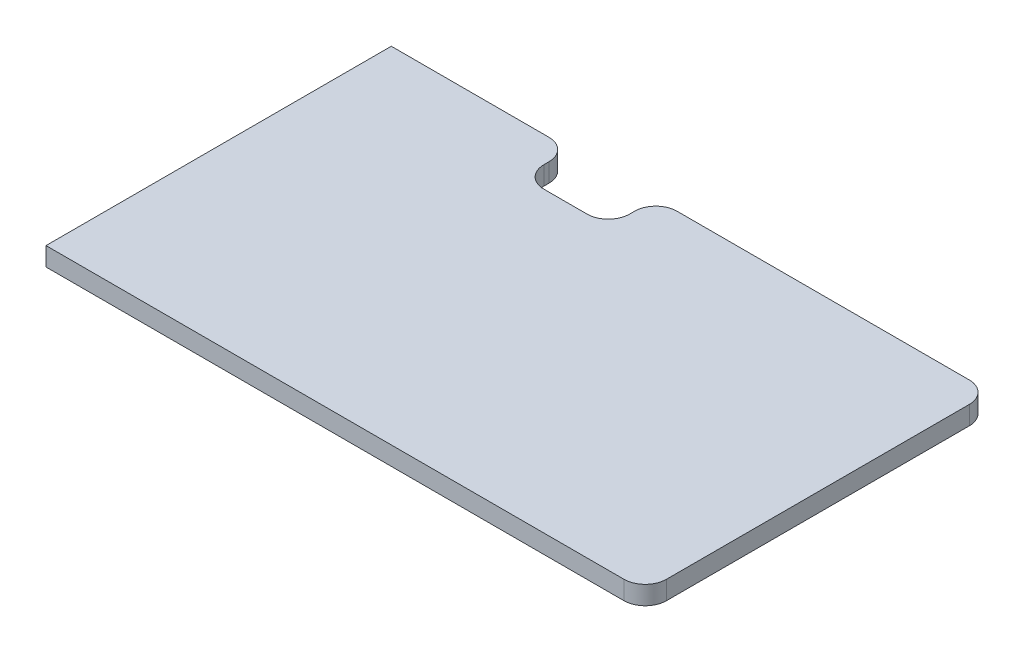
ISO-10303-21;
HEADER;
FILE_DESCRIPTION(('STEP AP214'),'2;1');
FILE_NAME('part.step','',(''),(''),'','','');
FILE_SCHEMA(('AUTOMOTIVE_DESIGN { 1 0 10303 214 1 1 1 1 }'));
ENDSEC;
DATA;
#1=APPLICATION_CONTEXT('core data for automotive mechanical design processes');
#2=APPLICATION_PROTOCOL_DEFINITION('international standard','automotive_design',2000,#1);
#3=PRODUCT_CONTEXT('',#1,'mechanical');
#4=PRODUCT('Part','Part','',(#3));
#5=PRODUCT_RELATED_PRODUCT_CATEGORY('part','',(#4));
#6=PRODUCT_DEFINITION_FORMATION('','',#4);
#7=PRODUCT_DEFINITION_CONTEXT('part definition',#1,'design');
#8=PRODUCT_DEFINITION('design','',#6,#7);
#9=PRODUCT_DEFINITION_SHAPE('','',#8);
#10=(LENGTH_UNIT() NAMED_UNIT(*) SI_UNIT(.MILLI.,.METRE.));
#11=(NAMED_UNIT(*) PLANE_ANGLE_UNIT() SI_UNIT($,.RADIAN.));
#12=(NAMED_UNIT(*) SI_UNIT($,.STERADIAN.) SOLID_ANGLE_UNIT());
#13=UNCERTAINTY_MEASURE_WITH_UNIT(LENGTH_MEASURE(1.E-05),#10,'distance_accuracy_value','');
#14=(GEOMETRIC_REPRESENTATION_CONTEXT(3) GLOBAL_UNCERTAINTY_ASSIGNED_CONTEXT((#13)) GLOBAL_UNIT_ASSIGNED_CONTEXT((#10,
#11,#12)) REPRESENTATION_CONTEXT('',''));
#15=CARTESIAN_POINT('',(0.,0.,0.));
#16=DIRECTION('',(0.,0.,1.));
#17=DIRECTION('',(1.,0.,0.));
#18=AXIS2_PLACEMENT_3D('',#15,#16,#17);
#19=CARTESIAN_POINT('',(-0.333250558352,0.28,0.215));
#20=DIRECTION('',(0.,-1.,0.));
#21=DIRECTION('',(0.,0.,-1.));
#22=AXIS2_PLACEMENT_3D('',#19,#20,#21);
#23=PLANE('',#22);
#24=DIRECTION('',(0.,0.,1.));
#25=VECTOR('',#24,1.);
#26=CARTESIAN_POINT('',(-0.63,0.28,0.825));
#27=LINE('',#26,#25);
#28=CARTESIAN_POINT('',(-0.63,0.28,0.175));
#29=VERTEX_POINT('',#28);
#30=CARTESIAN_POINT('',(-0.63,0.28,0.825));
#31=VERTEX_POINT('',#30);
#32=EDGE_CURVE('E174',#29,#31,#27,.T.);
#33=ORIENTED_EDGE('',*,*,#32,.F.);
#34=DIRECTION('',(-1.,0.,0.));
#35=VECTOR('',#34,1.);
#36=CARTESIAN_POINT('',(-0.63,0.28,0.175));
#37=LINE('',#36,#35);
#38=CARTESIAN_POINT('',(-0.333250558352,0.28,0.175));
#39=VERTEX_POINT('',#38);
#40=EDGE_CURVE('E28',#39,#29,#37,.T.);
#41=ORIENTED_EDGE('',*,*,#40,.F.);
#42=CARTESIAN_POINT('',(-0.333250558352,0.28,0.215));
#43=DIRECTION('',(0.,1.,0.));
#44=DIRECTION('',(0.,0.,-1.));
#45=AXIS2_PLACEMENT_3D('',#42,#43,#44);
#46=CIRCLE('',#45,0.04);
#47=CARTESIAN_POINT('',(-0.293250558352,0.28,0.215));
#48=VERTEX_POINT('',#47);
#49=EDGE_CURVE('E167',#48,#39,#46,.T.);
#50=ORIENTED_EDGE('',*,*,#49,.F.);
#51=DIRECTION('',(0.,0.,-1.));
#52=VECTOR('',#51,1.);
#53=CARTESIAN_POINT('',(-0.293250558352,0.28,0.215));
#54=LINE('',#53,#52);
#55=CARTESIAN_POINT('',(-0.293250558352,0.28,0.224389621479));
#56=VERTEX_POINT('',#55);
#57=EDGE_CURVE('E230',#56,#48,#54,.T.);
#58=ORIENTED_EDGE('',*,*,#57,.F.);
#59=CARTESIAN_POINT('',(-0.253250558352,0.28,0.224389621479));
#60=DIRECTION('',(0.,-1.,0.));
#61=DIRECTION('',(0.,0.,1.));
#62=AXIS2_PLACEMENT_3D('',#59,#60,#61);
#63=CIRCLE('',#62,0.04);
#64=CARTESIAN_POINT('',(-0.253250558352,0.28,0.264389621479));
#65=VERTEX_POINT('',#64);
#66=EDGE_CURVE('E190',#65,#56,#63,.T.);
#67=ORIENTED_EDGE('',*,*,#66,.F.);
#68=DIRECTION('',(-1.,0.,0.));
#69=VECTOR('',#68,1.);
#70=CARTESIAN_POINT('',(-0.253250558352,0.28,0.264389621479));
#71=LINE('',#70,#69);
#72=CARTESIAN_POINT('',(-0.172018831036,0.28,0.264389621479));
#73=VERTEX_POINT('',#72);
#74=EDGE_CURVE('E204',#73,#65,#71,.T.);
#75=ORIENTED_EDGE('',*,*,#74,.F.);
#76=CARTESIAN_POINT('',(-0.172018831036,0.28,0.224389621479));
#77=DIRECTION('',(0.,-1.,0.));
#78=DIRECTION('',(0.,0.,1.));
#79=AXIS2_PLACEMENT_3D('',#76,#77,#78);
#80=CIRCLE('',#79,0.04);
#81=CARTESIAN_POINT('',(-0.132018831036,0.28,0.224389621479));
#82=VERTEX_POINT('',#81);
#83=EDGE_CURVE('E173',#82,#73,#80,.T.);
#84=ORIENTED_EDGE('',*,*,#83,.F.);
#85=DIRECTION('',(0.,0.,1.));
#86=VECTOR('',#85,1.);
#87=CARTESIAN_POINT('',(-0.132018831036,0.28,0.224389621479));
#88=LINE('',#87,#86);
#89=CARTESIAN_POINT('',(-0.132018831036,0.28,0.215));
#90=VERTEX_POINT('',#89);
#91=EDGE_CURVE('E158',#90,#82,#88,.T.);
#92=ORIENTED_EDGE('',*,*,#91,.F.);
#93=CARTESIAN_POINT('',(-0.09201883103617,0.28,0.215));
#94=DIRECTION('',(0.,1.,0.));
#95=DIRECTION('',(0.,0.,-1.));
#96=AXIS2_PLACEMENT_3D('',#93,#94,#95);
#97=CIRCLE('',#96,0.04);
#98=CARTESIAN_POINT('',(-0.09201883103617,0.28,0.175));
#99=VERTEX_POINT('',#98);
#100=EDGE_CURVE('E211',#99,#90,#97,.T.);
#101=ORIENTED_EDGE('',*,*,#100,.F.);
#102=DIRECTION('',(-1.,0.,0.));
#103=VECTOR('',#102,1.);
#104=CARTESIAN_POINT('',(-0.09201883103617,0.28,0.175));
#105=LINE('',#104,#103);
#106=CARTESIAN_POINT('',(0.458042276458,0.28,0.175));
#107=VERTEX_POINT('',#106);
#108=EDGE_CURVE('E106',#107,#99,#105,.T.);
#109=ORIENTED_EDGE('',*,*,#108,.F.);
#110=CARTESIAN_POINT('',(0.458042276458,0.28,0.215));
#111=DIRECTION('',(0.,1.,0.));
#112=DIRECTION('',(0.,0.,-1.));
#113=AXIS2_PLACEMENT_3D('',#110,#111,#112);
#114=CIRCLE('',#113,0.04);
#115=CARTESIAN_POINT('',(0.498042276458,0.28,0.215));
#116=VERTEX_POINT('',#115);
#117=EDGE_CURVE('E137',#116,#107,#114,.T.);
#118=ORIENTED_EDGE('',*,*,#117,.F.);
#119=DIRECTION('',(0.,0.,-1.));
#120=VECTOR('',#119,1.);
#121=CARTESIAN_POINT('',(0.498042276458,0.28,0.215));
#122=LINE('',#121,#120);
#123=CARTESIAN_POINT('',(0.498042276458,0.28,0.785));
#124=VERTEX_POINT('',#123);
#125=EDGE_CURVE('E141',#124,#116,#122,.T.);
#126=ORIENTED_EDGE('',*,*,#125,.F.);
#127=CARTESIAN_POINT('',(0.458042276458,0.28,0.785));
#128=DIRECTION('',(0.,1.,0.));
#129=DIRECTION('',(0.,0.,-1.));
#130=AXIS2_PLACEMENT_3D('',#127,#128,#129);
#131=CIRCLE('',#130,0.04);
#132=CARTESIAN_POINT('',(0.458042276458,0.28,0.825));
#133=VERTEX_POINT('',#132);
#134=EDGE_CURVE('E182',#133,#124,#131,.T.);
#135=ORIENTED_EDGE('',*,*,#134,.F.);
#136=DIRECTION('',(1.,0.,0.));
#137=VECTOR('',#136,1.);
#138=CARTESIAN_POINT('',(0.458042276458,0.28,0.825));
#139=LINE('',#138,#137);
#140=EDGE_CURVE('E236',#31,#133,#139,.T.);
#141=ORIENTED_EDGE('',*,*,#140,.F.);
#142=EDGE_LOOP('',(#33,#41,#50,#58,#67,#75,#84,#92,#101,#109,#118,#126,#135,#141));
#143=FACE_BOUND('',#142,.T.);
#144=ADVANCED_FACE('F17',(#143),#23,.T.);
#145=CARTESIAN_POINT('',(-0.333250558352,0.315,0.215));
#146=DIRECTION('',(0.,-1.,0.));
#147=DIRECTION('',(0.,0.,-1.));
#148=AXIS2_PLACEMENT_3D('',#145,#146,#147);
#149=PLANE('',#148);
#150=DIRECTION('',(0.,0.,1.));
#151=VECTOR('',#150,1.);
#152=CARTESIAN_POINT('',(-0.63,0.315,0.825));
#153=LINE('',#152,#151);
#154=CARTESIAN_POINT('',(-0.63,0.315,0.175));
#155=VERTEX_POINT('',#154);
#156=CARTESIAN_POINT('',(-0.63,0.315,0.825));
#157=VERTEX_POINT('',#156);
#158=EDGE_CURVE('E195',#155,#157,#153,.T.);
#159=ORIENTED_EDGE('',*,*,#158,.T.);
#160=DIRECTION('',(1.,0.,0.));
#161=VECTOR('',#160,1.);
#162=CARTESIAN_POINT('',(0.458042276458,0.315,0.825));
#163=LINE('',#162,#161);
#164=CARTESIAN_POINT('',(0.458042276458,0.315,0.825));
#165=VERTEX_POINT('',#164);
#166=EDGE_CURVE('E179',#157,#165,#163,.T.);
#167=ORIENTED_EDGE('',*,*,#166,.T.);
#168=CARTESIAN_POINT('',(0.458042276458,0.315,0.785));
#169=DIRECTION('',(0.,1.,0.));
#170=DIRECTION('',(0.,0.,-1.));
#171=AXIS2_PLACEMENT_3D('',#168,#169,#170);
#172=CIRCLE('',#171,0.04);
#173=CARTESIAN_POINT('',(0.498042276458,0.315,0.785));
#174=VERTEX_POINT('',#173);
#175=EDGE_CURVE('E132',#165,#174,#172,.T.);
#176=ORIENTED_EDGE('',*,*,#175,.T.);
#177=DIRECTION('',(0.,0.,-1.));
#178=VECTOR('',#177,1.);
#179=CARTESIAN_POINT('',(0.498042276458,0.315,0.215));
#180=LINE('',#179,#178);
#181=CARTESIAN_POINT('',(0.498042276458,0.315,0.215));
#182=VERTEX_POINT('',#181);
#183=EDGE_CURVE('E128',#174,#182,#180,.T.);
#184=ORIENTED_EDGE('',*,*,#183,.T.);
#185=CARTESIAN_POINT('',(0.458042276458,0.315,0.215));
#186=DIRECTION('',(0.,1.,0.));
#187=DIRECTION('',(0.,0.,-1.));
#188=AXIS2_PLACEMENT_3D('',#185,#186,#187);
#189=CIRCLE('',#188,0.04);
#190=CARTESIAN_POINT('',(0.458042276458,0.315,0.175));
#191=VERTEX_POINT('',#190);
#192=EDGE_CURVE('E115',#182,#191,#189,.T.);
#193=ORIENTED_EDGE('',*,*,#192,.T.);
#194=DIRECTION('',(-1.,0.,0.));
#195=VECTOR('',#194,1.);
#196=CARTESIAN_POINT('',(-0.09201883103617,0.315,0.175));
#197=LINE('',#196,#195);
#198=CARTESIAN_POINT('',(-0.09201883103617,0.315,0.175));
#199=VERTEX_POINT('',#198);
#200=EDGE_CURVE('E208',#191,#199,#197,.T.);
#201=ORIENTED_EDGE('',*,*,#200,.T.);
#202=CARTESIAN_POINT('',(-0.09201883103617,0.315,0.215));
#203=DIRECTION('',(0.,1.,0.));
#204=DIRECTION('',(0.,0.,-1.));
#205=AXIS2_PLACEMENT_3D('',#202,#203,#204);
#206=CIRCLE('',#205,0.04);
#207=CARTESIAN_POINT('',(-0.132018831036,0.315,0.215));
#208=VERTEX_POINT('',#207);
#209=EDGE_CURVE('E161',#199,#208,#206,.T.);
#210=ORIENTED_EDGE('',*,*,#209,.T.);
#211=DIRECTION('',(0.,0.,1.));
#212=VECTOR('',#211,1.);
#213=CARTESIAN_POINT('',(-0.132018831036,0.315,0.224389621479));
#214=LINE('',#213,#212);
#215=CARTESIAN_POINT('',(-0.132018831036,0.315,0.224389621479));
#216=VERTEX_POINT('',#215);
#217=EDGE_CURVE('E200',#208,#216,#214,.T.);
#218=ORIENTED_EDGE('',*,*,#217,.T.);
#219=CARTESIAN_POINT('',(-0.172018831036,0.315,0.224389621479));
#220=DIRECTION('',(0.,-1.,0.));
#221=DIRECTION('',(0.,0.,1.));
#222=AXIS2_PLACEMENT_3D('',#219,#220,#221);
#223=CIRCLE('',#222,0.04);
#224=CARTESIAN_POINT('',(-0.172018831036,0.315,0.264389621479));
#225=VERTEX_POINT('',#224);
#226=EDGE_CURVE('E172',#216,#225,#223,.T.);
#227=ORIENTED_EDGE('',*,*,#226,.T.);
#228=DIRECTION('',(-1.,0.,0.));
#229=VECTOR('',#228,1.);
#230=CARTESIAN_POINT('',(-0.253250558352,0.315,0.264389621479));
#231=LINE('',#230,#229);
#232=CARTESIAN_POINT('',(-0.253250558352,0.315,0.264389621479));
#233=VERTEX_POINT('',#232);
#234=EDGE_CURVE('E186',#225,#233,#231,.T.);
#235=ORIENTED_EDGE('',*,*,#234,.T.);
#236=CARTESIAN_POINT('',(-0.253250558352,0.315,0.224389621479));
#237=DIRECTION('',(0.,-1.,0.));
#238=DIRECTION('',(0.,0.,1.));
#239=AXIS2_PLACEMENT_3D('',#236,#237,#238);
#240=CIRCLE('',#239,0.04);
#241=CARTESIAN_POINT('',(-0.293250558352,0.315,0.224389621479));
#242=VERTEX_POINT('',#241);
#243=EDGE_CURVE('E234',#233,#242,#240,.T.);
#244=ORIENTED_EDGE('',*,*,#243,.T.);
#245=DIRECTION('',(0.,0.,-1.));
#246=VECTOR('',#245,1.);
#247=CARTESIAN_POINT('',(-0.293250558352,0.315,0.215));
#248=LINE('',#247,#246);
#249=CARTESIAN_POINT('',(-0.293250558352,0.315,0.215));
#250=VERTEX_POINT('',#249);
#251=EDGE_CURVE('E265',#242,#250,#248,.T.);
#252=ORIENTED_EDGE('',*,*,#251,.T.);
#253=CARTESIAN_POINT('',(-0.333250558352,0.315,0.215));
#254=DIRECTION('',(0.,1.,0.));
#255=DIRECTION('',(0.,0.,-1.));
#256=AXIS2_PLACEMENT_3D('',#253,#254,#255);
#257=CIRCLE('',#256,0.04);
#258=CARTESIAN_POINT('',(-0.333250558352,0.315,0.175));
#259=VERTEX_POINT('',#258);
#260=EDGE_CURVE('E166',#250,#259,#257,.T.);
#261=ORIENTED_EDGE('',*,*,#260,.T.);
#262=DIRECTION('',(-1.,0.,0.));
#263=VECTOR('',#262,1.);
#264=CARTESIAN_POINT('',(-0.63,0.315,0.175));
#265=LINE('',#264,#263);
#266=EDGE_CURVE('E11',#259,#155,#265,.T.);
#267=ORIENTED_EDGE('',*,*,#266,.T.);
#268=EDGE_LOOP('',(#159,#167,#176,#184,#193,#201,#210,#218,#227,#235,#244,#252,#261,#267));
#269=FACE_BOUND('',#268,.T.);
#270=ADVANCED_FACE('F130',(#269),#149,.F.);
#271=CARTESIAN_POINT('',(-0.63,0.315,0.175));
#272=DIRECTION('',(0.,0.,1.));
#273=DIRECTION('',(1.,0.,0.));
#274=AXIS2_PLACEMENT_3D('',#271,#272,#273);
#275=PLANE('',#274);
#276=ORIENTED_EDGE('',*,*,#40,.T.);
#277=DIRECTION('',(0.,-1.,0.));
#278=VECTOR('',#277,1.);
#279=CARTESIAN_POINT('',(-0.63,0.315,0.175));
#280=LINE('',#279,#278);
#281=EDGE_CURVE('E243',#155,#29,#280,.T.);
#282=ORIENTED_EDGE('',*,*,#281,.F.);
#283=ORIENTED_EDGE('',*,*,#266,.F.);
#284=DIRECTION('',(0.,-1.,0.));
#285=VECTOR('',#284,1.);
#286=CARTESIAN_POINT('',(-0.333250558352,0.315,0.175));
#287=LINE('',#286,#285);
#288=EDGE_CURVE('E163',#259,#39,#287,.T.);
#289=ORIENTED_EDGE('',*,*,#288,.T.);
#290=EDGE_LOOP('',(#276,#282,#283,#289));
#291=FACE_BOUND('',#290,.T.);
#292=ADVANCED_FACE('F279',(#291),#275,.F.);
#293=CARTESIAN_POINT('',(-0.333250558352,0.315,0.215));
#294=DIRECTION('',(0.,-1.,0.));
#295=DIRECTION('',(0.,0.,-1.));
#296=AXIS2_PLACEMENT_3D('',#293,#294,#295);
#297=CYLINDRICAL_SURFACE('',#296,0.04);
#298=ORIENTED_EDGE('',*,*,#49,.T.);
#299=ORIENTED_EDGE('',*,*,#288,.F.);
#300=ORIENTED_EDGE('',*,*,#260,.F.);
#301=DIRECTION('',(0.,-1.,0.));
#302=VECTOR('',#301,1.);
#303=CARTESIAN_POINT('',(-0.293250558352,0.315,0.215));
#304=LINE('',#303,#302);
#305=EDGE_CURVE('E233',#250,#48,#304,.T.);
#306=ORIENTED_EDGE('',*,*,#305,.T.);
#307=EDGE_LOOP('',(#298,#299,#300,#306));
#308=FACE_BOUND('',#307,.T.);
#309=ADVANCED_FACE('F347',(#308),#297,.T.);
#310=CARTESIAN_POINT('',(-0.293250558352,0.315,0.215));
#311=DIRECTION('',(-1.,0.,0.));
#312=DIRECTION('',(0.,0.,1.));
#313=AXIS2_PLACEMENT_3D('',#310,#311,#312);
#314=PLANE('',#313);
#315=ORIENTED_EDGE('',*,*,#57,.T.);
#316=ORIENTED_EDGE('',*,*,#305,.F.);
#317=ORIENTED_EDGE('',*,*,#251,.F.);
#318=DIRECTION('',(0.,-1.,0.));
#319=VECTOR('',#318,1.);
#320=CARTESIAN_POINT('',(-0.293250558352,0.315,0.224389621479));
#321=LINE('',#320,#319);
#322=EDGE_CURVE('E156',#242,#56,#321,.T.);
#323=ORIENTED_EDGE('',*,*,#322,.T.);
#324=EDGE_LOOP('',(#315,#316,#317,#323));
#325=FACE_BOUND('',#324,.T.);
#326=ADVANCED_FACE('F350',(#325),#314,.F.);
#327=CARTESIAN_POINT('',(-0.253250558352,0.315,0.224389621479));
#328=DIRECTION('',(0.,-1.,0.));
#329=DIRECTION('',(0.,0.,-1.));
#330=AXIS2_PLACEMENT_3D('',#327,#328,#329);
#331=CYLINDRICAL_SURFACE('',#330,0.04);
#332=ORIENTED_EDGE('',*,*,#66,.T.);
#333=ORIENTED_EDGE('',*,*,#322,.F.);
#334=ORIENTED_EDGE('',*,*,#243,.F.);
#335=DIRECTION('',(0.,-1.,0.));
#336=VECTOR('',#335,1.);
#337=CARTESIAN_POINT('',(-0.253250558352,0.315,0.264389621479));
#338=LINE('',#337,#336);
#339=EDGE_CURVE('E191',#233,#65,#338,.T.);
#340=ORIENTED_EDGE('',*,*,#339,.T.);
#341=EDGE_LOOP('',(#332,#333,#334,#340));
#342=FACE_BOUND('',#341,.T.);
#343=ADVANCED_FACE('F354',(#342),#331,.F.);
#344=CARTESIAN_POINT('',(-0.253250558352,0.315,0.264389621479));
#345=DIRECTION('',(0.,0.,1.));
#346=DIRECTION('',(1.,0.,0.));
#347=AXIS2_PLACEMENT_3D('',#344,#345,#346);
#348=PLANE('',#347);
#349=ORIENTED_EDGE('',*,*,#74,.T.);
#350=ORIENTED_EDGE('',*,*,#339,.F.);
#351=ORIENTED_EDGE('',*,*,#234,.F.);
#352=DIRECTION('',(0.,-1.,0.));
#353=VECTOR('',#352,1.);
#354=CARTESIAN_POINT('',(-0.172018831036,0.315,0.264389621479));
#355=LINE('',#354,#353);
#356=EDGE_CURVE('E168',#225,#73,#355,.T.);
#357=ORIENTED_EDGE('',*,*,#356,.T.);
#358=EDGE_LOOP('',(#349,#350,#351,#357));
#359=FACE_BOUND('',#358,.T.);
#360=ADVANCED_FACE('F356',(#359),#348,.F.);
#361=CARTESIAN_POINT('',(-0.172018831036,0.315,0.224389621479));
#362=DIRECTION('',(0.,-1.,0.));
#363=DIRECTION('',(0.,0.,-1.));
#364=AXIS2_PLACEMENT_3D('',#361,#362,#363);
#365=CYLINDRICAL_SURFACE('',#364,0.04);
#366=ORIENTED_EDGE('',*,*,#83,.T.);
#367=ORIENTED_EDGE('',*,*,#356,.F.);
#368=ORIENTED_EDGE('',*,*,#226,.F.);
#369=DIRECTION('',(0.,-1.,0.));
#370=VECTOR('',#369,1.);
#371=CARTESIAN_POINT('',(-0.132018831036,0.315,0.224389621479));
#372=LINE('',#371,#370);
#373=EDGE_CURVE('E160',#216,#82,#372,.T.);
#374=ORIENTED_EDGE('',*,*,#373,.T.);
#375=EDGE_LOOP('',(#366,#367,#368,#374));
#376=FACE_BOUND('',#375,.T.);
#377=ADVANCED_FACE('F19',(#376),#365,.F.);
#378=CARTESIAN_POINT('',(-0.132018831036,0.315,0.224389621479));
#379=DIRECTION('',(1.,0.,0.));
#380=DIRECTION('',(0.,1.,0.));
#381=AXIS2_PLACEMENT_3D('',#378,#379,#380);
#382=PLANE('',#381);
#383=ORIENTED_EDGE('',*,*,#91,.T.);
#384=ORIENTED_EDGE('',*,*,#373,.F.);
#385=ORIENTED_EDGE('',*,*,#217,.F.);
#386=DIRECTION('',(0.,-1.,0.));
#387=VECTOR('',#386,1.);
#388=CARTESIAN_POINT('',(-0.132018831036,0.315,0.215));
#389=LINE('',#388,#387);
#390=EDGE_CURVE('E198',#208,#90,#389,.T.);
#391=ORIENTED_EDGE('',*,*,#390,.T.);
#392=EDGE_LOOP('',(#383,#384,#385,#391));
#393=FACE_BOUND('',#392,.T.);
#394=ADVANCED_FACE('F329',(#393),#382,.F.);
#395=CARTESIAN_POINT('',(-0.09201883103617,0.315,0.215));
#396=DIRECTION('',(0.,-1.,0.));
#397=DIRECTION('',(0.,0.,-1.));
#398=AXIS2_PLACEMENT_3D('',#395,#396,#397);
#399=CYLINDRICAL_SURFACE('',#398,0.04);
#400=ORIENTED_EDGE('',*,*,#100,.T.);
#401=ORIENTED_EDGE('',*,*,#390,.F.);
#402=ORIENTED_EDGE('',*,*,#209,.F.);
#403=DIRECTION('',(0.,-1.,0.));
#404=VECTOR('',#403,1.);
#405=CARTESIAN_POINT('',(-0.09201883103617,0.315,0.175));
#406=LINE('',#405,#404);
#407=EDGE_CURVE('E212',#199,#99,#406,.T.);
#408=ORIENTED_EDGE('',*,*,#407,.T.);
#409=EDGE_LOOP('',(#400,#401,#402,#408));
#410=FACE_BOUND('',#409,.T.);
#411=ADVANCED_FACE('F332',(#410),#399,.T.);
#412=CARTESIAN_POINT('',(-0.09201883103617,0.315,0.175));
#413=DIRECTION('',(0.,0.,1.));
#414=DIRECTION('',(1.,0.,0.));
#415=AXIS2_PLACEMENT_3D('',#412,#413,#414);
#416=PLANE('',#415);
#417=ORIENTED_EDGE('',*,*,#108,.T.);
#418=ORIENTED_EDGE('',*,*,#407,.F.);
#419=ORIENTED_EDGE('',*,*,#200,.F.);
#420=DIRECTION('',(0.,-1.,0.));
#421=VECTOR('',#420,1.);
#422=CARTESIAN_POINT('',(0.458042276458,0.315,0.175));
#423=LINE('',#422,#421);
#424=EDGE_CURVE('E121',#191,#107,#423,.T.);
#425=ORIENTED_EDGE('',*,*,#424,.T.);
#426=EDGE_LOOP('',(#417,#418,#419,#425));
#427=FACE_BOUND('',#426,.T.);
#428=ADVANCED_FACE('F335',(#427),#416,.F.);
#429=CARTESIAN_POINT('',(0.458042276458,0.315,0.215));
#430=DIRECTION('',(0.,-1.,0.));
#431=DIRECTION('',(0.,0.,-1.));
#432=AXIS2_PLACEMENT_3D('',#429,#430,#431);
#433=CYLINDRICAL_SURFACE('',#432,0.04);
#434=ORIENTED_EDGE('',*,*,#117,.T.);
#435=ORIENTED_EDGE('',*,*,#424,.F.);
#436=ORIENTED_EDGE('',*,*,#192,.F.);
#437=DIRECTION('',(0.,-1.,0.));
#438=VECTOR('',#437,1.);
#439=CARTESIAN_POINT('',(0.498042276458,0.315,0.215));
#440=LINE('',#439,#438);
#441=EDGE_CURVE('E21',#182,#116,#440,.T.);
#442=ORIENTED_EDGE('',*,*,#441,.T.);
#443=EDGE_LOOP('',(#434,#435,#436,#442));
#444=FACE_BOUND('',#443,.T.);
#445=ADVANCED_FACE('F118',(#444),#433,.T.);
#446=CARTESIAN_POINT('',(0.498042276458,0.315,0.215));
#447=DIRECTION('',(-1.,0.,0.));
#448=DIRECTION('',(0.,0.,1.));
#449=AXIS2_PLACEMENT_3D('',#446,#447,#448);
#450=PLANE('',#449);
#451=ORIENTED_EDGE('',*,*,#125,.T.);
#452=ORIENTED_EDGE('',*,*,#441,.F.);
#453=ORIENTED_EDGE('',*,*,#183,.F.);
#454=DIRECTION('',(0.,-1.,0.));
#455=VECTOR('',#454,1.);
#456=CARTESIAN_POINT('',(0.498042276458,0.315,0.785));
#457=LINE('',#456,#455);
#458=EDGE_CURVE('E152',#174,#124,#457,.T.);
#459=ORIENTED_EDGE('',*,*,#458,.T.);
#460=EDGE_LOOP('',(#451,#452,#453,#459));
#461=FACE_BOUND('',#460,.T.);
#462=ADVANCED_FACE('F139',(#461),#450,.F.);
#463=CARTESIAN_POINT('',(0.458042276458,0.315,0.785));
#464=DIRECTION('',(0.,-1.,0.));
#465=DIRECTION('',(0.,0.,-1.));
#466=AXIS2_PLACEMENT_3D('',#463,#464,#465);
#467=CYLINDRICAL_SURFACE('',#466,0.04);
#468=ORIENTED_EDGE('',*,*,#134,.T.);
#469=ORIENTED_EDGE('',*,*,#458,.F.);
#470=ORIENTED_EDGE('',*,*,#175,.F.);
#471=DIRECTION('',(0.,-1.,0.));
#472=VECTOR('',#471,1.);
#473=CARTESIAN_POINT('',(0.458042276458,0.315,0.825));
#474=LINE('',#473,#472);
#475=EDGE_CURVE('E183',#165,#133,#474,.T.);
#476=ORIENTED_EDGE('',*,*,#475,.T.);
#477=EDGE_LOOP('',(#468,#469,#470,#476));
#478=FACE_BOUND('',#477,.T.);
#479=ADVANCED_FACE('F336',(#478),#467,.T.);
#480=CARTESIAN_POINT('',(0.458042276458,0.315,0.825));
#481=DIRECTION('',(0.,0.,-1.));
#482=DIRECTION('',(0.,-1.,0.));
#483=AXIS2_PLACEMENT_3D('',#480,#481,#482);
#484=PLANE('',#483);
#485=ORIENTED_EDGE('',*,*,#140,.T.);
#486=ORIENTED_EDGE('',*,*,#475,.F.);
#487=ORIENTED_EDGE('',*,*,#166,.F.);
#488=DIRECTION('',(0.,-1.,0.));
#489=VECTOR('',#488,1.);
#490=CARTESIAN_POINT('',(-0.63,0.315,0.825));
#491=LINE('',#490,#489);
#492=EDGE_CURVE('E178',#157,#31,#491,.T.);
#493=ORIENTED_EDGE('',*,*,#492,.T.);
#494=EDGE_LOOP('',(#485,#486,#487,#493));
#495=FACE_BOUND('',#494,.T.);
#496=ADVANCED_FACE('F295',(#495),#484,.F.);
#497=CARTESIAN_POINT('',(-0.63,0.315,0.825));
#498=DIRECTION('',(1.,0.,0.));
#499=DIRECTION('',(0.,0.,-1.));
#500=AXIS2_PLACEMENT_3D('',#497,#498,#499);
#501=PLANE('',#500);
#502=ORIENTED_EDGE('',*,*,#32,.T.);
#503=ORIENTED_EDGE('',*,*,#492,.F.);
#504=ORIENTED_EDGE('',*,*,#158,.F.);
#505=ORIENTED_EDGE('',*,*,#281,.T.);
#506=EDGE_LOOP('',(#502,#503,#504,#505));
#507=FACE_BOUND('',#506,.T.);
#508=ADVANCED_FACE('F289',(#507),#501,.F.);
#509=CLOSED_SHELL('',(#144,#270,#292,#309,#326,#343,#360,#377,#394,#411,#428,#445,#462,#479,
#496,#508));
#510=MANIFOLD_SOLID_BREP('B1',#509);
#511=ADVANCED_BREP_SHAPE_REPRESENTATION('',(#18,#510),#14);
#512=SHAPE_DEFINITION_REPRESENTATION(#9,#511);
ENDSEC;
END-ISO-10303-21;
